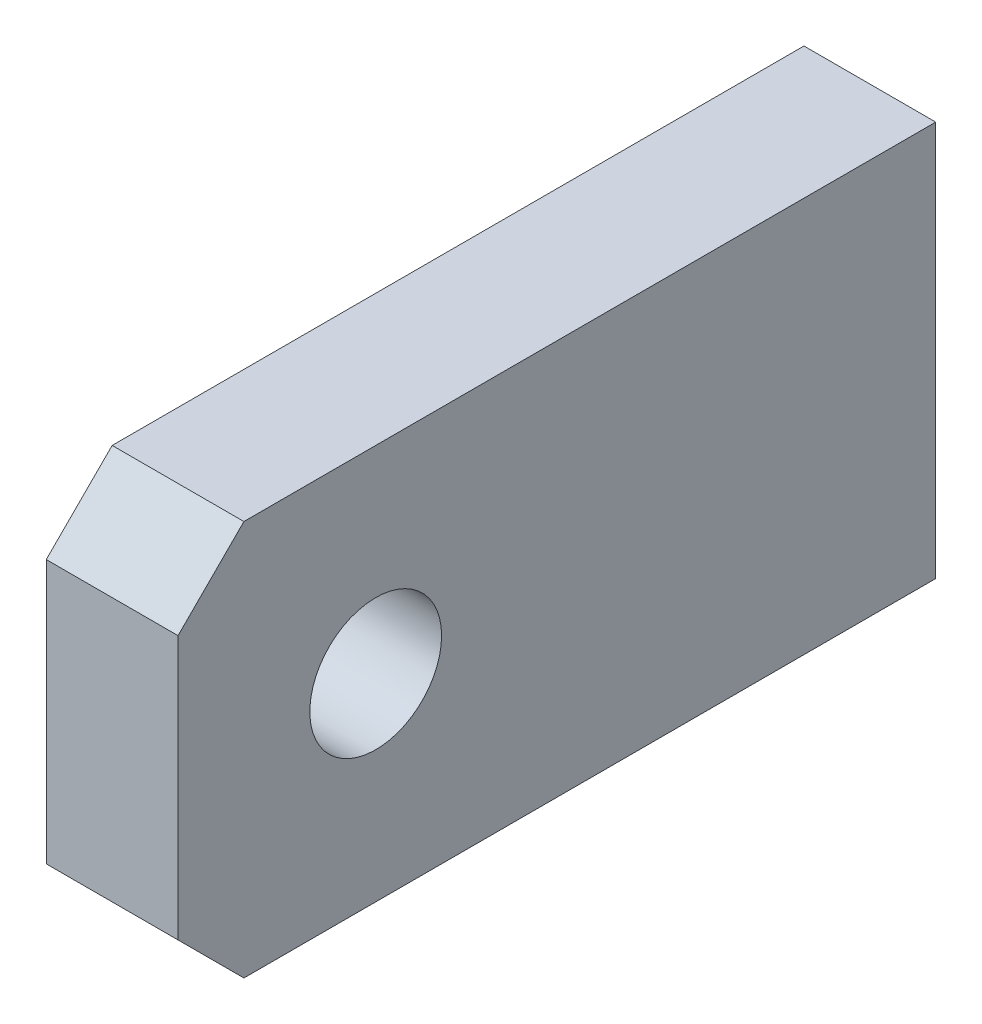
ISO-10303-21;
HEADER;
FILE_DESCRIPTION(('STEP AP214'),'2;1');
FILE_NAME('part.step','',(''),(''),'','','');
FILE_SCHEMA(('AUTOMOTIVE_DESIGN { 1 0 10303 214 1 1 1 1 }'));
ENDSEC;
DATA;
#1=APPLICATION_CONTEXT('core data for automotive mechanical design processes');
#2=APPLICATION_PROTOCOL_DEFINITION('international standard','automotive_design',2000,#1);
#3=PRODUCT_CONTEXT('',#1,'mechanical');
#4=PRODUCT('Part','Part','',(#3));
#5=PRODUCT_RELATED_PRODUCT_CATEGORY('part','',(#4));
#6=PRODUCT_DEFINITION_FORMATION('','',#4);
#7=PRODUCT_DEFINITION_CONTEXT('part definition',#1,'design');
#8=PRODUCT_DEFINITION('design','',#6,#7);
#9=PRODUCT_DEFINITION_SHAPE('','',#8);
#10=(LENGTH_UNIT() NAMED_UNIT(*) SI_UNIT(.MILLI.,.METRE.));
#11=(NAMED_UNIT(*) PLANE_ANGLE_UNIT() SI_UNIT($,.RADIAN.));
#12=(NAMED_UNIT(*) SI_UNIT($,.STERADIAN.) SOLID_ANGLE_UNIT());
#13=UNCERTAINTY_MEASURE_WITH_UNIT(LENGTH_MEASURE(1.E-05),#10,'distance_accuracy_value','');
#14=(GEOMETRIC_REPRESENTATION_CONTEXT(3) GLOBAL_UNCERTAINTY_ASSIGNED_CONTEXT((#13)) GLOBAL_UNIT_ASSIGNED_CONTEXT((#10,
#11,#12)) REPRESENTATION_CONTEXT('',''));
#15=CARTESIAN_POINT('',(0.,0.,0.));
#16=DIRECTION('',(0.,0.,1.));
#17=DIRECTION('',(1.,0.,0.));
#18=AXIS2_PLACEMENT_3D('',#15,#16,#17);
#19=CARTESIAN_POINT('',(-4.,-6.,-11.5));
#20=DIRECTION('',(0.,0.,-1.));
#21=DIRECTION('',(-1.,0.,0.));
#22=AXIS2_PLACEMENT_3D('',#19,#20,#21);
#23=PLANE('',#22);
#24=CARTESIAN_POINT('',(-2.,-4.,-11.5));
#25=DIRECTION('',(0.,0.,-1.));
#26=DIRECTION('',(-1.,0.,0.));
#27=AXIS2_PLACEMENT_3D('',#24,#25,#26);
#28=CIRCLE('',#27,1.5);
#29=CARTESIAN_POINT('',(-3.5,-4.,-11.5));
#30=VERTEX_POINT('',#29);
#31=EDGE_CURVE('E213',#30,#30,#28,.T.);
#32=ORIENTED_EDGE('',*,*,#31,.F.);
#33=EDGE_LOOP('',(#32));
#34=FACE_BOUND('',#33,.T.);
#35=CARTESIAN_POINT('',(-2.,4.,-11.5));
#36=DIRECTION('',(0.,0.,-1.));
#37=DIRECTION('',(-1.,0.,0.));
#38=AXIS2_PLACEMENT_3D('',#35,#36,#37);
#39=CIRCLE('',#38,1.5);
#40=CARTESIAN_POINT('',(-3.5,4.,-11.5));
#41=VERTEX_POINT('',#40);
#42=EDGE_CURVE('E116',#41,#41,#39,.T.);
#43=ORIENTED_EDGE('',*,*,#42,.F.);
#44=EDGE_LOOP('',(#43));
#45=FACE_BOUND('',#44,.T.);
#46=DIRECTION('',(0.,1.,0.));
#47=VECTOR('',#46,1.);
#48=CARTESIAN_POINT('',(0.,-6.,-11.5));
#49=LINE('',#48,#47);
#50=CARTESIAN_POINT('',(0.,-6.,-11.5));
#51=VERTEX_POINT('',#50);
#52=CARTESIAN_POINT('',(0.,6.,-11.5));
#53=VERTEX_POINT('',#52);
#54=EDGE_CURVE('E122',#51,#53,#49,.T.);
#55=ORIENTED_EDGE('',*,*,#54,.F.);
#56=DIRECTION('',(1.,0.,0.));
#57=VECTOR('',#56,1.);
#58=CARTESIAN_POINT('',(-4.,-6.,-11.5));
#59=LINE('',#58,#57);
#60=CARTESIAN_POINT('',(-4.,-6.,-11.5));
#61=VERTEX_POINT('',#60);
#62=EDGE_CURVE('E101',#61,#51,#59,.T.);
#63=ORIENTED_EDGE('',*,*,#62,.F.);
#64=DIRECTION('',(0.,1.,0.));
#65=VECTOR('',#64,1.);
#66=CARTESIAN_POINT('',(-4.,-6.,-11.5));
#67=LINE('',#66,#65);
#68=CARTESIAN_POINT('',(-4.,6.,-11.5));
#69=VERTEX_POINT('',#68);
#70=EDGE_CURVE('E106',#61,#69,#67,.T.);
#71=ORIENTED_EDGE('',*,*,#70,.T.);
#72=DIRECTION('',(1.,0.,0.));
#73=VECTOR('',#72,1.);
#74=CARTESIAN_POINT('',(-4.,6.,-11.5));
#75=LINE('',#74,#73);
#76=EDGE_CURVE('E91',#69,#53,#75,.T.);
#77=ORIENTED_EDGE('',*,*,#76,.T.);
#78=EDGE_LOOP('',(#55,#63,#71,#77));
#79=FACE_BOUND('',#78,.T.);
#80=ADVANCED_FACE('F35',(#34,#45,#79),#23,.T.);
#81=CARTESIAN_POINT('',(-4.,-6.,11.5));
#82=DIRECTION('',(0.,-1.,0.));
#83=DIRECTION('',(0.,0.,-1.));
#84=AXIS2_PLACEMENT_3D('',#81,#82,#83);
#85=PLANE('',#84);
#86=DIRECTION('',(0.,0.,-1.));
#87=VECTOR('',#86,1.);
#88=CARTESIAN_POINT('',(0.,-6.,11.5));
#89=LINE('',#88,#87);
#90=CARTESIAN_POINT('',(0.,-6.,9.5));
#91=VERTEX_POINT('',#90);
#92=EDGE_CURVE('E111',#91,#51,#89,.T.);
#93=ORIENTED_EDGE('',*,*,#92,.F.);
#94=DIRECTION('',(-1.,0.,0.));
#95=VECTOR('',#94,1.);
#96=CARTESIAN_POINT('',(-4.,-6.,9.5));
#97=LINE('',#96,#95);
#98=CARTESIAN_POINT('',(-4.,-6.,9.5));
#99=VERTEX_POINT('',#98);
#100=EDGE_CURVE('E59',#91,#99,#97,.T.);
#101=ORIENTED_EDGE('',*,*,#100,.T.);
#102=DIRECTION('',(0.,0.,-1.));
#103=VECTOR('',#102,1.);
#104=CARTESIAN_POINT('',(-4.,-6.,11.5));
#105=LINE('',#104,#103);
#106=EDGE_CURVE('E102',#99,#61,#105,.T.);
#107=ORIENTED_EDGE('',*,*,#106,.T.);
#108=ORIENTED_EDGE('',*,*,#62,.T.);
#109=EDGE_LOOP('',(#93,#101,#107,#108));
#110=FACE_BOUND('',#109,.T.);
#111=ADVANCED_FACE('F149',(#110),#85,.T.);
#112=CARTESIAN_POINT('',(-4.,-6.,11.5));
#113=DIRECTION('',(0.,0.,1.));
#114=DIRECTION('',(1.,0.,0.));
#115=AXIS2_PLACEMENT_3D('',#112,#113,#114);
#116=PLANE('',#115);
#117=DIRECTION('',(0.,-1.,0.));
#118=VECTOR('',#117,1.);
#119=CARTESIAN_POINT('',(-4.,-6.,11.5));
#120=LINE('',#119,#118);
#121=CARTESIAN_POINT('',(-4.,3.99999999999999,11.5));
#122=VERTEX_POINT('',#121);
#123=CARTESIAN_POINT('',(-4.,-4.,11.5));
#124=VERTEX_POINT('',#123);
#125=EDGE_CURVE('E107',#122,#124,#120,.T.);
#126=ORIENTED_EDGE('',*,*,#125,.T.);
#127=DIRECTION('',(1.,0.,0.));
#128=VECTOR('',#127,1.);
#129=CARTESIAN_POINT('',(-4.,-4.,11.5));
#130=LINE('',#129,#128);
#131=CARTESIAN_POINT('',(0.,-4.,11.5));
#132=VERTEX_POINT('',#131);
#133=EDGE_CURVE('E131',#124,#132,#130,.T.);
#134=ORIENTED_EDGE('',*,*,#133,.T.);
#135=DIRECTION('',(0.,-1.,0.));
#136=VECTOR('',#135,1.);
#137=CARTESIAN_POINT('',(0.,-6.,11.5));
#138=LINE('',#137,#136);
#139=CARTESIAN_POINT('',(0.,3.99999999999999,11.5));
#140=VERTEX_POINT('',#139);
#141=EDGE_CURVE('E113',#140,#132,#138,.T.);
#142=ORIENTED_EDGE('',*,*,#141,.F.);
#143=DIRECTION('',(-1.,0.,0.));
#144=VECTOR('',#143,1.);
#145=CARTESIAN_POINT('',(-4.,3.99999999999999,11.5));
#146=LINE('',#145,#144);
#147=EDGE_CURVE('E128',#140,#122,#146,.T.);
#148=ORIENTED_EDGE('',*,*,#147,.T.);
#149=EDGE_LOOP('',(#126,#134,#142,#148));
#150=FACE_BOUND('',#149,.T.);
#151=ADVANCED_FACE('F143',(#150),#116,.T.);
#152=CARTESIAN_POINT('',(-4.,6.,11.5));
#153=DIRECTION('',(0.,1.,0.));
#154=DIRECTION('',(0.,0.,1.));
#155=AXIS2_PLACEMENT_3D('',#152,#153,#154);
#156=PLANE('',#155);
#157=DIRECTION('',(0.,0.,1.));
#158=VECTOR('',#157,1.);
#159=CARTESIAN_POINT('',(-4.,6.,11.5));
#160=LINE('',#159,#158);
#161=CARTESIAN_POINT('',(-4.,6.,9.5));
#162=VERTEX_POINT('',#161);
#163=EDGE_CURVE('E93',#69,#162,#160,.T.);
#164=ORIENTED_EDGE('',*,*,#163,.T.);
#165=DIRECTION('',(1.,0.,0.));
#166=VECTOR('',#165,1.);
#167=CARTESIAN_POINT('',(-4.,6.,9.5));
#168=LINE('',#167,#166);
#169=CARTESIAN_POINT('',(0.,6.,9.5));
#170=VERTEX_POINT('',#169);
#171=EDGE_CURVE('E11',#162,#170,#168,.T.);
#172=ORIENTED_EDGE('',*,*,#171,.T.);
#173=DIRECTION('',(0.,0.,1.));
#174=VECTOR('',#173,1.);
#175=CARTESIAN_POINT('',(0.,6.,11.5));
#176=LINE('',#175,#174);
#177=EDGE_CURVE('E96',#53,#170,#176,.T.);
#178=ORIENTED_EDGE('',*,*,#177,.F.);
#179=ORIENTED_EDGE('',*,*,#76,.F.);
#180=EDGE_LOOP('',(#164,#172,#178,#179));
#181=FACE_BOUND('',#180,.T.);
#182=ADVANCED_FACE('F92',(#181),#156,.T.);
#183=CARTESIAN_POINT('',(-4.,0.,0.));
#184=DIRECTION('',(-1.,0.,0.));
#185=DIRECTION('',(0.,0.,1.));
#186=AXIS2_PLACEMENT_3D('',#183,#184,#185);
#187=PLANE('',#186);
#188=CARTESIAN_POINT('',(-4.,0.,5.5));
#189=DIRECTION('',(1.,0.,0.));
#190=DIRECTION('',(0.,0.,-1.));
#191=AXIS2_PLACEMENT_3D('',#188,#189,#190);
#192=CIRCLE('',#191,2.);
#193=CARTESIAN_POINT('',(-4.,0.,3.5));
#194=VERTEX_POINT('',#193);
#195=EDGE_CURVE('E204',#194,#194,#192,.T.);
#196=ORIENTED_EDGE('',*,*,#195,.T.);
#197=EDGE_LOOP('',(#196));
#198=FACE_BOUND('',#197,.T.);
#199=ORIENTED_EDGE('',*,*,#106,.F.);
#200=DIRECTION('',(0.,-0.707106781186546,-0.707106781186549));
#201=VECTOR('',#200,1.);
#202=CARTESIAN_POINT('',(-4.,-7.75000000000001,7.74999999999998));
#203=LINE('',#202,#201);
#204=EDGE_CURVE('E44',#99,#124,#203,.F.);
#205=ORIENTED_EDGE('',*,*,#204,.T.);
#206=ORIENTED_EDGE('',*,*,#125,.F.);
#207=DIRECTION('',(0.,-0.707106781186548,0.707106781186547));
#208=VECTOR('',#207,1.);
#209=CARTESIAN_POINT('',(-4.,7.74999999999999,7.75000000000001));
#210=LINE('',#209,#208);
#211=EDGE_CURVE('E51',#122,#162,#210,.F.);
#212=ORIENTED_EDGE('',*,*,#211,.T.);
#213=ORIENTED_EDGE('',*,*,#163,.F.);
#214=ORIENTED_EDGE('',*,*,#70,.F.);
#215=EDGE_LOOP('',(#199,#205,#206,#212,#213,#214));
#216=FACE_BOUND('',#215,.T.);
#217=ADVANCED_FACE('F105',(#198,#216),#187,.T.);
#218=CARTESIAN_POINT('',(0.,0.,0.));
#219=DIRECTION('',(-1.,0.,0.));
#220=DIRECTION('',(0.,0.,1.));
#221=AXIS2_PLACEMENT_3D('',#218,#219,#220);
#222=PLANE('',#221);
#223=CARTESIAN_POINT('',(0.,0.,5.5));
#224=DIRECTION('',(1.,0.,0.));
#225=DIRECTION('',(0.,0.,-1.));
#226=AXIS2_PLACEMENT_3D('',#223,#224,#225);
#227=CIRCLE('',#226,2.);
#228=CARTESIAN_POINT('',(0.,0.,3.5));
#229=VERTEX_POINT('',#228);
#230=EDGE_CURVE('E207',#229,#229,#227,.T.);
#231=ORIENTED_EDGE('',*,*,#230,.F.);
#232=EDGE_LOOP('',(#231));
#233=FACE_BOUND('',#232,.T.);
#234=ORIENTED_EDGE('',*,*,#141,.T.);
#235=DIRECTION('',(0.,0.707106781186546,0.707106781186549));
#236=VECTOR('',#235,1.);
#237=CARTESIAN_POINT('',(0.,-4.,11.5));
#238=LINE('',#237,#236);
#239=EDGE_CURVE('E136',#132,#91,#238,.F.);
#240=ORIENTED_EDGE('',*,*,#239,.T.);
#241=ORIENTED_EDGE('',*,*,#92,.T.);
#242=ORIENTED_EDGE('',*,*,#54,.T.);
#243=ORIENTED_EDGE('',*,*,#177,.T.);
#244=DIRECTION('',(0.,0.707106781186548,-0.707106781186547));
#245=VECTOR('',#244,1.);
#246=CARTESIAN_POINT('',(0.,6.,9.5));
#247=LINE('',#246,#245);
#248=EDGE_CURVE('E134',#170,#140,#247,.F.);
#249=ORIENTED_EDGE('',*,*,#248,.T.);
#250=EDGE_LOOP('',(#234,#240,#241,#242,#243,#249));
#251=FACE_BOUND('',#250,.T.);
#252=ADVANCED_FACE('F148',(#233,#251),#222,.F.);
#253=CARTESIAN_POINT('',(-2.,4.,-1.5));
#254=DIRECTION('',(0.,0.,-1.));
#255=DIRECTION('',(-1.,0.,0.));
#256=AXIS2_PLACEMENT_3D('',#253,#254,#255);
#257=CYLINDRICAL_SURFACE('',#256,1.5);
#258=CARTESIAN_POINT('',(-2.,4.,-1.5));
#259=DIRECTION('',(0.,0.,-1.));
#260=DIRECTION('',(-1.,0.,0.));
#261=AXIS2_PLACEMENT_3D('',#258,#259,#260);
#262=CIRCLE('',#261,1.5);
#263=CARTESIAN_POINT('',(-3.5,4.,-1.5));
#264=VERTEX_POINT('',#263);
#265=EDGE_CURVE('E215',#264,#264,#262,.T.);
#266=ORIENTED_EDGE('',*,*,#265,.F.);
#267=EDGE_LOOP('',(#266));
#268=FACE_BOUND('',#267,.T.);
#269=ORIENTED_EDGE('',*,*,#42,.T.);
#270=EDGE_LOOP('',(#269));
#271=FACE_BOUND('',#270,.T.);
#272=ADVANCED_FACE('F177',(#268,#271),#257,.F.);
#273=CARTESIAN_POINT('',(-2.,4.,-1.5));
#274=DIRECTION('',(0.,0.,-1.));
#275=DIRECTION('',(-1.,0.,0.));
#276=AXIS2_PLACEMENT_3D('',#273,#274,#275);
#277=PLANE('',#276);
#278=ORIENTED_EDGE('',*,*,#265,.T.);
#279=EDGE_LOOP('',(#278));
#280=FACE_BOUND('',#279,.T.);
#281=ADVANCED_FACE('F184',(#280),#277,.T.);
#282=CARTESIAN_POINT('',(-2.,-4.,-1.5));
#283=DIRECTION('',(0.,0.,-1.));
#284=DIRECTION('',(-1.,0.,0.));
#285=AXIS2_PLACEMENT_3D('',#282,#283,#284);
#286=CYLINDRICAL_SURFACE('',#285,1.5);
#287=CARTESIAN_POINT('',(-2.,-4.,-1.5));
#288=DIRECTION('',(0.,0.,-1.));
#289=DIRECTION('',(-1.,0.,0.));
#290=AXIS2_PLACEMENT_3D('',#287,#288,#289);
#291=CIRCLE('',#290,1.5);
#292=CARTESIAN_POINT('',(-3.5,-4.,-1.5));
#293=VERTEX_POINT('',#292);
#294=EDGE_CURVE('E124',#293,#293,#291,.T.);
#295=ORIENTED_EDGE('',*,*,#294,.F.);
#296=EDGE_LOOP('',(#295));
#297=FACE_BOUND('',#296,.T.);
#298=ORIENTED_EDGE('',*,*,#31,.T.);
#299=EDGE_LOOP('',(#298));
#300=FACE_BOUND('',#299,.T.);
#301=ADVANCED_FACE('F188',(#297,#300),#286,.F.);
#302=CARTESIAN_POINT('',(-2.,-4.,-1.5));
#303=DIRECTION('',(0.,0.,-1.));
#304=DIRECTION('',(-1.,0.,0.));
#305=AXIS2_PLACEMENT_3D('',#302,#303,#304);
#306=PLANE('',#305);
#307=ORIENTED_EDGE('',*,*,#294,.T.);
#308=EDGE_LOOP('',(#307));
#309=FACE_BOUND('',#308,.T.);
#310=ADVANCED_FACE('F192',(#309),#306,.T.);
#311=CARTESIAN_POINT('',(-4.,0.,5.5));
#312=DIRECTION('',(1.,0.,0.));
#313=DIRECTION('',(0.,0.,-1.));
#314=AXIS2_PLACEMENT_3D('',#311,#312,#313);
#315=CYLINDRICAL_SURFACE('',#314,2.);
#316=ORIENTED_EDGE('',*,*,#195,.F.);
#317=EDGE_LOOP('',(#316));
#318=FACE_BOUND('',#317,.T.);
#319=ORIENTED_EDGE('',*,*,#230,.T.);
#320=EDGE_LOOP('',(#319));
#321=FACE_BOUND('',#320,.T.);
#322=ADVANCED_FACE('F155',(#318,#321),#315,.F.);
#323=CARTESIAN_POINT('',(-4.,-4.,11.5));
#324=DIRECTION('',(0.,0.707106781186549,-0.707106781186546));
#325=DIRECTION('',(1.,0.,0.));
#326=AXIS2_PLACEMENT_3D('',#323,#324,#325);
#327=PLANE('',#326);
#328=ORIENTED_EDGE('',*,*,#204,.F.);
#329=ORIENTED_EDGE('',*,*,#100,.F.);
#330=ORIENTED_EDGE('',*,*,#239,.F.);
#331=ORIENTED_EDGE('',*,*,#133,.F.);
#332=EDGE_LOOP('',(#328,#329,#330,#331));
#333=FACE_BOUND('',#332,.T.);
#334=ADVANCED_FACE('F146',(#333),#327,.F.);
#335=CARTESIAN_POINT('',(-4.,6.,9.5));
#336=DIRECTION('',(0.,-0.707106781186547,-0.707106781186548));
#337=DIRECTION('',(1.,0.,0.));
#338=AXIS2_PLACEMENT_3D('',#335,#336,#337);
#339=PLANE('',#338);
#340=ORIENTED_EDGE('',*,*,#211,.F.);
#341=ORIENTED_EDGE('',*,*,#147,.F.);
#342=ORIENTED_EDGE('',*,*,#248,.F.);
#343=ORIENTED_EDGE('',*,*,#171,.F.);
#344=EDGE_LOOP('',(#340,#341,#342,#343));
#345=FACE_BOUND('',#344,.T.);
#346=ADVANCED_FACE('F38',(#345),#339,.F.);
#347=CLOSED_SHELL('',(#80,#111,#151,#182,#217,#252,#272,#281,#301,#310,#322,#334,#346));
#348=MANIFOLD_SOLID_BREP('B2',#347);
#349=ADVANCED_BREP_SHAPE_REPRESENTATION('',(#18,#348),#14);
#350=SHAPE_DEFINITION_REPRESENTATION(#9,#349);
ENDSEC;
END-ISO-10303-21;
